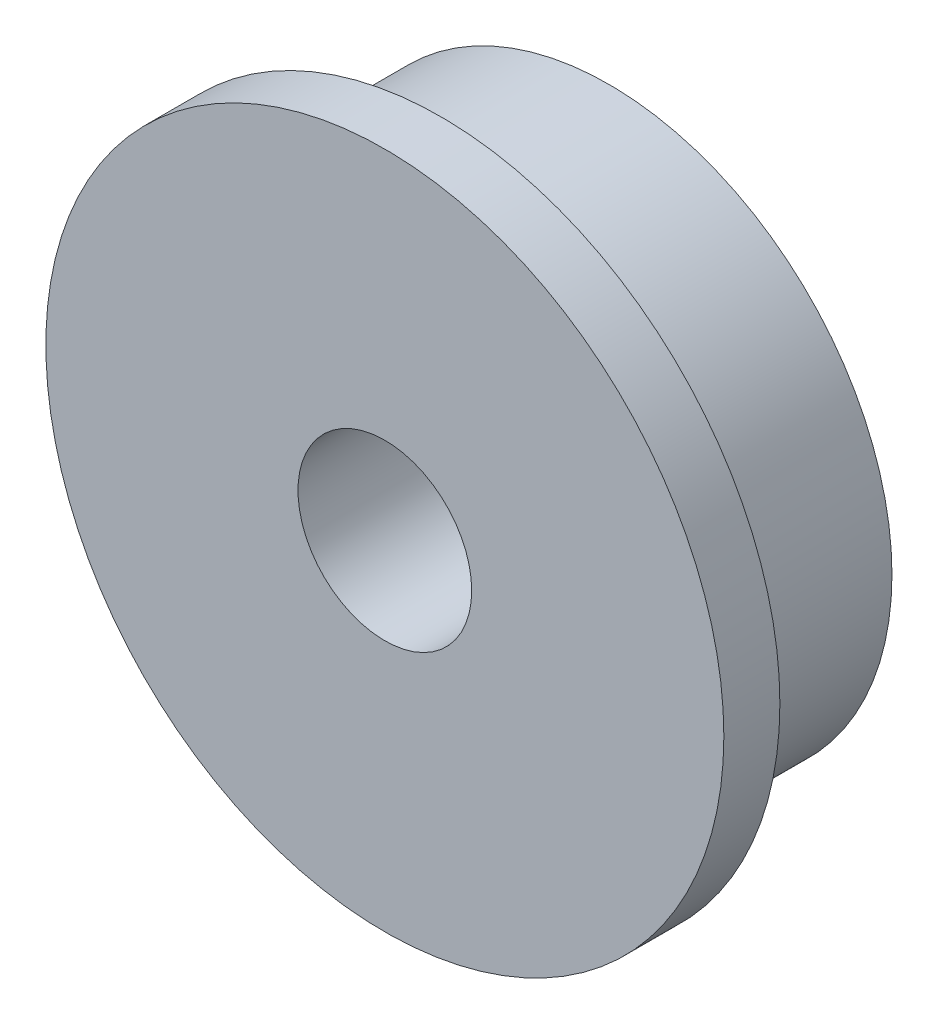
ISO-10303-21;
HEADER;
FILE_DESCRIPTION(('STEP AP214'),'2;1');
FILE_NAME('part.step','',(''),(''),'','','');
FILE_SCHEMA(('AUTOMOTIVE_DESIGN { 1 0 10303 214 1 1 1 1 }'));
ENDSEC;
DATA;
#1=APPLICATION_CONTEXT('core data for automotive mechanical design processes');
#2=APPLICATION_PROTOCOL_DEFINITION('international standard','automotive_design',2000,#1);
#3=PRODUCT_CONTEXT('',#1,'mechanical');
#4=PRODUCT('Part','Part','',(#3));
#5=PRODUCT_RELATED_PRODUCT_CATEGORY('part','',(#4));
#6=PRODUCT_DEFINITION_FORMATION('','',#4);
#7=PRODUCT_DEFINITION_CONTEXT('part definition',#1,'design');
#8=PRODUCT_DEFINITION('design','',#6,#7);
#9=PRODUCT_DEFINITION_SHAPE('','',#8);
#10=(LENGTH_UNIT() NAMED_UNIT(*) SI_UNIT(.MILLI.,.METRE.));
#11=(NAMED_UNIT(*) PLANE_ANGLE_UNIT() SI_UNIT($,.RADIAN.));
#12=(NAMED_UNIT(*) SI_UNIT($,.STERADIAN.) SOLID_ANGLE_UNIT());
#13=UNCERTAINTY_MEASURE_WITH_UNIT(LENGTH_MEASURE(1.E-05),#10,'distance_accuracy_value','');
#14=(GEOMETRIC_REPRESENTATION_CONTEXT(3) GLOBAL_UNCERTAINTY_ASSIGNED_CONTEXT((#13)) GLOBAL_UNIT_ASSIGNED_CONTEXT((#10,
#11,#12)) REPRESENTATION_CONTEXT('',''));
#15=CARTESIAN_POINT('',(0.,0.,0.));
#16=DIRECTION('',(0.,0.,1.));
#17=DIRECTION('',(1.,0.,0.));
#18=AXIS2_PLACEMENT_3D('',#15,#16,#17);
#19=CARTESIAN_POINT('',(0.,0.,0.));
#20=DIRECTION('',(0.,0.,1.));
#21=DIRECTION('',(1.,0.,0.));
#22=AXIS2_PLACEMENT_3D('',#19,#20,#21);
#23=PLANE('',#22);
#24=CARTESIAN_POINT('',(0.,0.,0.));
#25=DIRECTION('',(0.,0.,1.));
#26=DIRECTION('',(1.,0.,0.));
#27=AXIS2_PLACEMENT_3D('',#24,#25,#26);
#28=CIRCLE('',#27,5.05);
#29=CARTESIAN_POINT('',(5.05,0.,0.));
#30=VERTEX_POINT('',#29);
#31=EDGE_CURVE('E48',#30,#30,#28,.T.);
#32=ORIENTED_EDGE('',*,*,#31,.F.);
#33=EDGE_LOOP('',(#32));
#34=FACE_BOUND('',#33,.T.);
#35=CARTESIAN_POINT('',(0.,0.,0.));
#36=DIRECTION('',(0.,0.,1.));
#37=DIRECTION('',(1.,0.,0.));
#38=AXIS2_PLACEMENT_3D('',#35,#36,#37);
#39=CIRCLE('',#38,1.55);
#40=CARTESIAN_POINT('',(1.55,0.,0.));
#41=VERTEX_POINT('',#40);
#42=EDGE_CURVE('E55',#41,#41,#39,.T.);
#43=ORIENTED_EDGE('',*,*,#42,.T.);
#44=EDGE_LOOP('',(#43));
#45=FACE_BOUND('',#44,.T.);
#46=ADVANCED_FACE('F44',(#34,#45),#23,.F.);
#47=CARTESIAN_POINT('',(0.,0.,3.));
#48=DIRECTION('',(0.,0.,-1.));
#49=DIRECTION('',(-1.,0.,0.));
#50=AXIS2_PLACEMENT_3D('',#47,#48,#49);
#51=CYLINDRICAL_SURFACE('',#50,5.05);
#52=CARTESIAN_POINT('',(0.,0.,3.));
#53=DIRECTION('',(0.,0.,1.));
#54=DIRECTION('',(1.,0.,0.));
#55=AXIS2_PLACEMENT_3D('',#52,#53,#54);
#56=CIRCLE('',#55,5.05);
#57=CARTESIAN_POINT('',(5.05,0.,3.));
#58=VERTEX_POINT('',#57);
#59=EDGE_CURVE('E12',#58,#58,#56,.T.);
#60=ORIENTED_EDGE('',*,*,#59,.F.);
#61=EDGE_LOOP('',(#60));
#62=FACE_BOUND('',#61,.T.);
#63=ORIENTED_EDGE('',*,*,#31,.T.);
#64=EDGE_LOOP('',(#63));
#65=FACE_BOUND('',#64,.T.);
#66=ADVANCED_FACE('F46',(#62,#65),#51,.T.);
#67=CARTESIAN_POINT('',(0.,0.,3.));
#68=DIRECTION('',(0.,0.,-1.));
#69=DIRECTION('',(-1.,0.,0.));
#70=AXIS2_PLACEMENT_3D('',#67,#68,#69);
#71=CYLINDRICAL_SURFACE('',#70,1.55);
#72=ORIENTED_EDGE('',*,*,#42,.F.);
#73=EDGE_LOOP('',(#72));
#74=FACE_BOUND('',#73,.T.);
#75=CARTESIAN_POINT('',(0.,0.,4.));
#76=DIRECTION('',(0.,0.,1.));
#77=DIRECTION('',(1.,0.,0.));
#78=AXIS2_PLACEMENT_3D('',#75,#76,#77);
#79=CIRCLE('',#78,1.55);
#80=CARTESIAN_POINT('',(1.55,0.,4.));
#81=VERTEX_POINT('',#80);
#82=EDGE_CURVE('E63',#81,#81,#79,.T.);
#83=ORIENTED_EDGE('',*,*,#82,.T.);
#84=EDGE_LOOP('',(#83));
#85=FACE_BOUND('',#84,.T.);
#86=ADVANCED_FACE('F69',(#74,#85),#71,.F.);
#87=CARTESIAN_POINT('',(0.,0.,4.));
#88=DIRECTION('',(0.,0.,1.));
#89=DIRECTION('',(1.,0.,0.));
#90=AXIS2_PLACEMENT_3D('',#87,#88,#89);
#91=PLANE('',#90);
#92=CARTESIAN_POINT('',(0.,0.,4.));
#93=DIRECTION('',(0.,0.,1.));
#94=DIRECTION('',(1.,0.,0.));
#95=AXIS2_PLACEMENT_3D('',#92,#93,#94);
#96=CIRCLE('',#95,6.05);
#97=CARTESIAN_POINT('',(6.05,0.,4.));
#98=VERTEX_POINT('',#97);
#99=EDGE_CURVE('E59',#98,#98,#96,.T.);
#100=ORIENTED_EDGE('',*,*,#99,.T.);
#101=EDGE_LOOP('',(#100));
#102=FACE_BOUND('',#101,.T.);
#103=ORIENTED_EDGE('',*,*,#82,.F.);
#104=EDGE_LOOP('',(#103));
#105=FACE_BOUND('',#104,.T.);
#106=ADVANCED_FACE('F71',(#102,#105),#91,.T.);
#107=CARTESIAN_POINT('',(0.,0.,3.));
#108=DIRECTION('',(0.,0.,1.));
#109=DIRECTION('',(1.,0.,0.));
#110=AXIS2_PLACEMENT_3D('',#107,#108,#109);
#111=PLANE('',#110);
#112=ORIENTED_EDGE('',*,*,#59,.T.);
#113=EDGE_LOOP('',(#112));
#114=FACE_BOUND('',#113,.T.);
#115=CARTESIAN_POINT('',(0.,0.,3.));
#116=DIRECTION('',(0.,0.,1.));
#117=DIRECTION('',(1.,0.,0.));
#118=AXIS2_PLACEMENT_3D('',#115,#116,#117);
#119=CIRCLE('',#118,6.05);
#120=CARTESIAN_POINT('',(6.05,0.,3.));
#121=VERTEX_POINT('',#120);
#122=EDGE_CURVE('E60',#121,#121,#119,.T.);
#123=ORIENTED_EDGE('',*,*,#122,.F.);
#124=EDGE_LOOP('',(#123));
#125=FACE_BOUND('',#124,.T.);
#126=ADVANCED_FACE('F73',(#114,#125),#111,.F.);
#127=CARTESIAN_POINT('',(0.,0.,4.));
#128=DIRECTION('',(0.,0.,-1.));
#129=DIRECTION('',(-1.,0.,0.));
#130=AXIS2_PLACEMENT_3D('',#127,#128,#129);
#131=CYLINDRICAL_SURFACE('',#130,6.05);
#132=ORIENTED_EDGE('',*,*,#99,.F.);
#133=EDGE_LOOP('',(#132));
#134=FACE_BOUND('',#133,.T.);
#135=ORIENTED_EDGE('',*,*,#122,.T.);
#136=EDGE_LOOP('',(#135));
#137=FACE_BOUND('',#136,.T.);
#138=ADVANCED_FACE('F80',(#134,#137),#131,.T.);
#139=CLOSED_SHELL('',(#46,#66,#86,#106,#126,#138));
#140=MANIFOLD_SOLID_BREP('B2',#139);
#141=ADVANCED_BREP_SHAPE_REPRESENTATION('',(#18,#140),#14);
#142=SHAPE_DEFINITION_REPRESENTATION(#9,#141);
ENDSEC;
END-ISO-10303-21;
